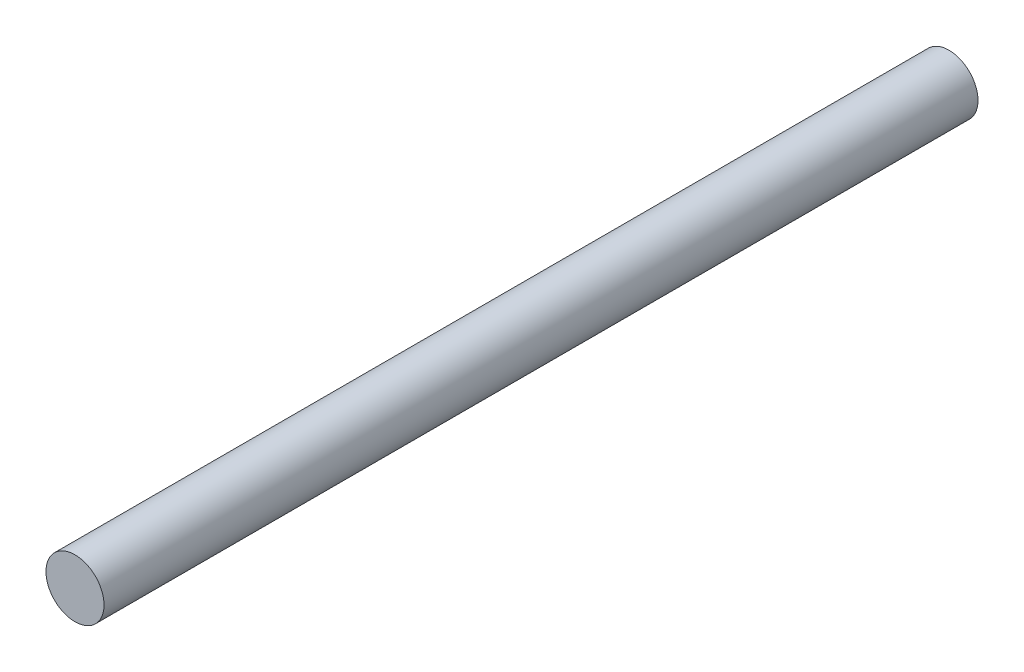
ISO-10303-21;
HEADER;
FILE_DESCRIPTION(('STEP AP214'),'2;1');
FILE_NAME('part.step','',(''),(''),'','','');
FILE_SCHEMA(('AUTOMOTIVE_DESIGN { 1 0 10303 214 1 1 1 1 }'));
ENDSEC;
DATA;
#1=APPLICATION_CONTEXT('core data for automotive mechanical design processes');
#2=APPLICATION_PROTOCOL_DEFINITION('international standard','automotive_design',2000,#1);
#3=PRODUCT_CONTEXT('',#1,'mechanical');
#4=PRODUCT('Part','Part','',(#3));
#5=PRODUCT_RELATED_PRODUCT_CATEGORY('part','',(#4));
#6=PRODUCT_DEFINITION_FORMATION('','',#4);
#7=PRODUCT_DEFINITION_CONTEXT('part definition',#1,'design');
#8=PRODUCT_DEFINITION('design','',#6,#7);
#9=PRODUCT_DEFINITION_SHAPE('','',#8);
#10=(LENGTH_UNIT() NAMED_UNIT(*) SI_UNIT(.MILLI.,.METRE.));
#11=(NAMED_UNIT(*) PLANE_ANGLE_UNIT() SI_UNIT($,.RADIAN.));
#12=(NAMED_UNIT(*) SI_UNIT($,.STERADIAN.) SOLID_ANGLE_UNIT());
#13=UNCERTAINTY_MEASURE_WITH_UNIT(LENGTH_MEASURE(1.E-05),#10,'distance_accuracy_value','');
#14=(GEOMETRIC_REPRESENTATION_CONTEXT(3) GLOBAL_UNCERTAINTY_ASSIGNED_CONTEXT((#13)) GLOBAL_UNIT_ASSIGNED_CONTEXT((#10,
#11,#12)) REPRESENTATION_CONTEXT('',''));
#15=CARTESIAN_POINT('',(0.,0.,0.));
#16=DIRECTION('',(0.,0.,1.));
#17=DIRECTION('',(1.,0.,0.));
#18=AXIS2_PLACEMENT_3D('',#15,#16,#17);
#19=CARTESIAN_POINT('',(0.,0.,120.4));
#20=DIRECTION('',(0.,0.,-1.));
#21=DIRECTION('',(-1.,0.,0.));
#22=AXIS2_PLACEMENT_3D('',#19,#20,#21);
#23=CYLINDRICAL_SURFACE('',#22,4.);
#24=CARTESIAN_POINT('',(0.,0.,120.4));
#25=DIRECTION('',(0.,0.,1.));
#26=DIRECTION('',(1.,0.,0.));
#27=AXIS2_PLACEMENT_3D('',#24,#25,#26);
#28=CIRCLE('',#27,4.);
#29=CARTESIAN_POINT('',(4.,0.,120.4));
#30=VERTEX_POINT('',#29);
#31=EDGE_CURVE('E10',#30,#30,#28,.T.);
#32=ORIENTED_EDGE('',*,*,#31,.F.);
#33=EDGE_LOOP('',(#32));
#34=FACE_BOUND('',#33,.T.);
#35=CARTESIAN_POINT('',(0.,0.,0.));
#36=DIRECTION('',(0.,0.,1.));
#37=DIRECTION('',(1.,0.,0.));
#38=AXIS2_PLACEMENT_3D('',#35,#36,#37);
#39=CIRCLE('',#38,4.);
#40=CARTESIAN_POINT('',(4.,0.,0.));
#41=VERTEX_POINT('',#40);
#42=EDGE_CURVE('E36',#41,#41,#39,.T.);
#43=ORIENTED_EDGE('',*,*,#42,.T.);
#44=EDGE_LOOP('',(#43));
#45=FACE_BOUND('',#44,.T.);
#46=ADVANCED_FACE('F33',(#34,#45),#23,.T.);
#47=CARTESIAN_POINT('',(0.,0.,120.4));
#48=DIRECTION('',(0.,0.,1.));
#49=DIRECTION('',(1.,0.,0.));
#50=AXIS2_PLACEMENT_3D('',#47,#48,#49);
#51=PLANE('',#50);
#52=ORIENTED_EDGE('',*,*,#31,.T.);
#53=EDGE_LOOP('',(#52));
#54=FACE_BOUND('',#53,.T.);
#55=ADVANCED_FACE('F48',(#54),#51,.T.);
#56=CARTESIAN_POINT('',(0.,0.,0.));
#57=DIRECTION('',(0.,0.,1.));
#58=DIRECTION('',(1.,0.,0.));
#59=AXIS2_PLACEMENT_3D('',#56,#57,#58);
#60=PLANE('',#59);
#61=ORIENTED_EDGE('',*,*,#42,.F.);
#62=EDGE_LOOP('',(#61));
#63=FACE_BOUND('',#62,.T.);
#64=ADVANCED_FACE('F46',(#63),#60,.F.);
#65=CLOSED_SHELL('',(#46,#55,#64));
#66=MANIFOLD_SOLID_BREP('B2',#65);
#67=ADVANCED_BREP_SHAPE_REPRESENTATION('',(#18,#66),#14);
#68=SHAPE_DEFINITION_REPRESENTATION(#9,#67);
ENDSEC;
END-ISO-10303-21;
